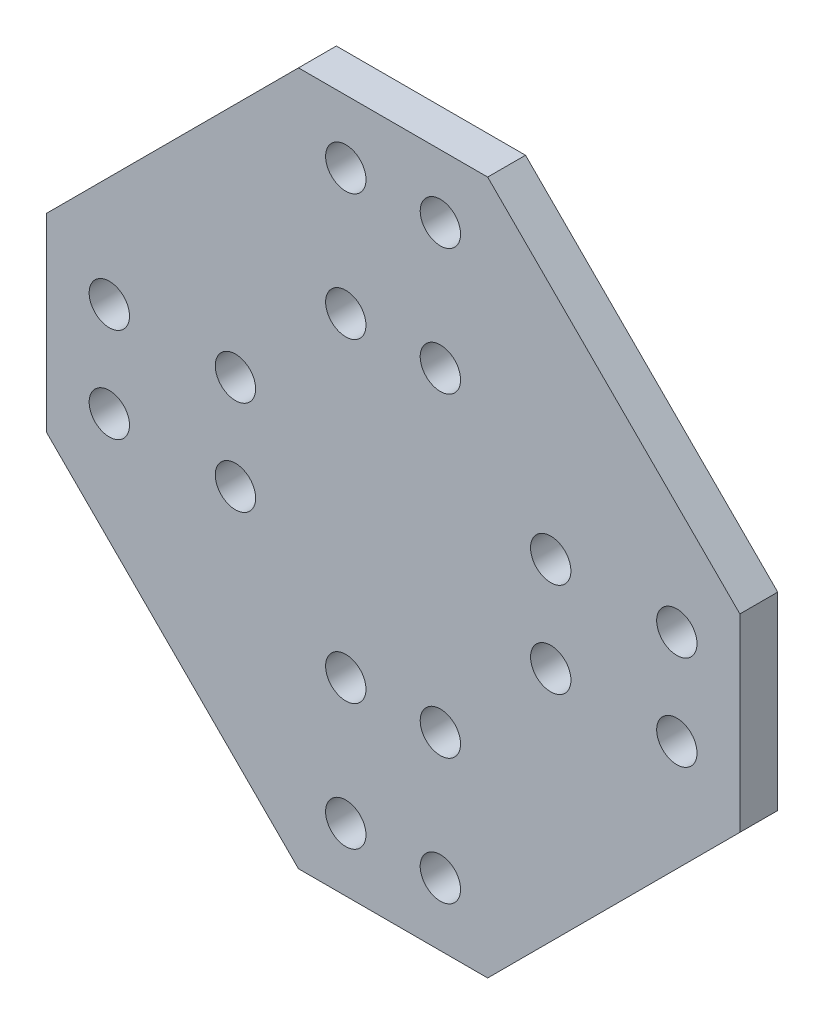
ISO-10303-21;
HEADER;
FILE_DESCRIPTION(('STEP AP214'),'2;1');
FILE_NAME('part.step','',(''),(''),'','','');
FILE_SCHEMA(('AUTOMOTIVE_DESIGN { 1 0 10303 214 1 1 1 1 }'));
ENDSEC;
DATA;
#1=APPLICATION_CONTEXT('core data for automotive mechanical design processes');
#2=APPLICATION_PROTOCOL_DEFINITION('international standard','automotive_design',2000,#1);
#3=PRODUCT_CONTEXT('',#1,'mechanical');
#4=PRODUCT('Part','Part','',(#3));
#5=PRODUCT_RELATED_PRODUCT_CATEGORY('part','',(#4));
#6=PRODUCT_DEFINITION_FORMATION('','',#4);
#7=PRODUCT_DEFINITION_CONTEXT('part definition',#1,'design');
#8=PRODUCT_DEFINITION('design','',#6,#7);
#9=PRODUCT_DEFINITION_SHAPE('','',#8);
#10=(LENGTH_UNIT() NAMED_UNIT(*) SI_UNIT(.MILLI.,.METRE.));
#11=(NAMED_UNIT(*) PLANE_ANGLE_UNIT() SI_UNIT($,.RADIAN.));
#12=(NAMED_UNIT(*) SI_UNIT($,.STERADIAN.) SOLID_ANGLE_UNIT());
#13=UNCERTAINTY_MEASURE_WITH_UNIT(LENGTH_MEASURE(1.E-05),#10,'distance_accuracy_value','');
#14=(GEOMETRIC_REPRESENTATION_CONTEXT(3) GLOBAL_UNCERTAINTY_ASSIGNED_CONTEXT((#13)) GLOBAL_UNIT_ASSIGNED_CONTEXT((#10,
#11,#12)) REPRESENTATION_CONTEXT('',''));
#15=CARTESIAN_POINT('',(0.,0.,0.));
#16=DIRECTION('',(0.,0.,1.));
#17=DIRECTION('',(1.,0.,0.));
#18=AXIS2_PLACEMENT_3D('',#15,#16,#17);
#19=CARTESIAN_POINT('',(-20.,-20.,3.));
#20=DIRECTION('',(0.707106781186548,-0.707106781186547,0.));
#21=DIRECTION('',(0.707106781186547,0.707106781186548,0.));
#22=AXIS2_PLACEMENT_3D('',#19,#20,#21);
#23=PLANE('',#22);
#24=DIRECTION('',(-0.707106781186547,-0.707106781186548,0.));
#25=VECTOR('',#24,1.);
#26=CARTESIAN_POINT('',(-20.,-20.,0.));
#27=LINE('',#26,#25);
#28=CARTESIAN_POINT('',(0.,0.,0.));
#29=VERTEX_POINT('',#28);
#30=CARTESIAN_POINT('',(-20.,-20.,0.));
#31=VERTEX_POINT('',#30);
#32=EDGE_CURVE('E144',#29,#31,#27,.T.);
#33=ORIENTED_EDGE('',*,*,#32,.T.);
#34=DIRECTION('',(0.,0.,-1.));
#35=VECTOR('',#34,1.);
#36=CARTESIAN_POINT('',(-20.,-20.,3.));
#37=LINE('',#36,#35);
#38=CARTESIAN_POINT('',(-20.,-20.,3.));
#39=VERTEX_POINT('',#38);
#40=EDGE_CURVE('E11',#39,#31,#37,.T.);
#41=ORIENTED_EDGE('',*,*,#40,.F.);
#42=DIRECTION('',(-0.707106781186547,-0.707106781186548,0.));
#43=VECTOR('',#42,1.);
#44=CARTESIAN_POINT('',(-20.,-20.,3.));
#45=LINE('',#44,#43);
#46=CARTESIAN_POINT('',(0.,0.,3.));
#47=VERTEX_POINT('',#46);
#48=EDGE_CURVE('E167',#47,#39,#45,.T.);
#49=ORIENTED_EDGE('',*,*,#48,.F.);
#50=DIRECTION('',(0.,0.,-1.));
#51=VECTOR('',#50,1.);
#52=CARTESIAN_POINT('',(0.,0.,3.));
#53=LINE('',#52,#51);
#54=EDGE_CURVE('E140',#47,#29,#53,.T.);
#55=ORIENTED_EDGE('',*,*,#54,.T.);
#56=EDGE_LOOP('',(#33,#41,#49,#55));
#57=FACE_BOUND('',#56,.T.);
#58=ADVANCED_FACE('F43',(#57),#23,.F.);
#59=CARTESIAN_POINT('',(-20.,-35.,3.));
#60=DIRECTION('',(1.,0.,0.));
#61=DIRECTION('',(0.,0.,-1.));
#62=AXIS2_PLACEMENT_3D('',#59,#60,#61);
#63=PLANE('',#62);
#64=DIRECTION('',(0.,-1.,0.));
#65=VECTOR('',#64,1.);
#66=CARTESIAN_POINT('',(-20.,-35.,0.));
#67=LINE('',#66,#65);
#68=CARTESIAN_POINT('',(-20.,-35.,0.));
#69=VERTEX_POINT('',#68);
#70=EDGE_CURVE('E148',#31,#69,#67,.T.);
#71=ORIENTED_EDGE('',*,*,#70,.T.);
#72=DIRECTION('',(0.,0.,-1.));
#73=VECTOR('',#72,1.);
#74=CARTESIAN_POINT('',(-20.,-35.,3.));
#75=LINE('',#74,#73);
#76=CARTESIAN_POINT('',(-20.,-35.,3.));
#77=VERTEX_POINT('',#76);
#78=EDGE_CURVE('E52',#77,#69,#75,.T.);
#79=ORIENTED_EDGE('',*,*,#78,.F.);
#80=DIRECTION('',(0.,-1.,0.));
#81=VECTOR('',#80,1.);
#82=CARTESIAN_POINT('',(-20.,-35.,3.));
#83=LINE('',#82,#81);
#84=EDGE_CURVE('E103',#39,#77,#83,.T.);
#85=ORIENTED_EDGE('',*,*,#84,.F.);
#86=ORIENTED_EDGE('',*,*,#40,.T.);
#87=EDGE_LOOP('',(#71,#79,#85,#86));
#88=FACE_BOUND('',#87,.T.);
#89=ADVANCED_FACE('F370',(#88),#63,.F.);
#90=CARTESIAN_POINT('',(0.,-55.,3.));
#91=DIRECTION('',(0.707106781186547,0.707106781186548,0.));
#92=DIRECTION('',(-0.707106781186548,0.707106781186547,0.));
#93=AXIS2_PLACEMENT_3D('',#90,#91,#92);
#94=PLANE('',#93);
#95=DIRECTION('',(0.707106781186548,-0.707106781186547,0.));
#96=VECTOR('',#95,1.);
#97=CARTESIAN_POINT('',(0.,-55.,0.));
#98=LINE('',#97,#96);
#99=CARTESIAN_POINT('',(0.,-55.,0.));
#100=VERTEX_POINT('',#99);
#101=EDGE_CURVE('E152',#69,#100,#98,.T.);
#102=ORIENTED_EDGE('',*,*,#101,.T.);
#103=DIRECTION('',(0.,0.,-1.));
#104=VECTOR('',#103,1.);
#105=CARTESIAN_POINT('',(0.,-55.,3.));
#106=LINE('',#105,#104);
#107=CARTESIAN_POINT('',(0.,-55.,3.));
#108=VERTEX_POINT('',#107);
#109=EDGE_CURVE('E178',#108,#100,#106,.T.);
#110=ORIENTED_EDGE('',*,*,#109,.F.);
#111=DIRECTION('',(0.707106781186548,-0.707106781186547,0.));
#112=VECTOR('',#111,1.);
#113=CARTESIAN_POINT('',(0.,-55.,3.));
#114=LINE('',#113,#112);
#115=EDGE_CURVE('E188',#77,#108,#114,.T.);
#116=ORIENTED_EDGE('',*,*,#115,.F.);
#117=ORIENTED_EDGE('',*,*,#78,.T.);
#118=EDGE_LOOP('',(#102,#110,#116,#117));
#119=FACE_BOUND('',#118,.T.);
#120=ADVANCED_FACE('F186',(#119),#94,.F.);
#121=CARTESIAN_POINT('',(15.,-55.,3.));
#122=DIRECTION('',(0.,1.,0.));
#123=DIRECTION('',(0.,0.,1.));
#124=AXIS2_PLACEMENT_3D('',#121,#122,#123);
#125=PLANE('',#124);
#126=DIRECTION('',(1.,0.,0.));
#127=VECTOR('',#126,1.);
#128=CARTESIAN_POINT('',(15.,-55.,0.));
#129=LINE('',#128,#127);
#130=CARTESIAN_POINT('',(15.,-55.,0.));
#131=VERTEX_POINT('',#130);
#132=EDGE_CURVE('E155',#100,#131,#129,.T.);
#133=ORIENTED_EDGE('',*,*,#132,.T.);
#134=DIRECTION('',(0.,0.,-1.));
#135=VECTOR('',#134,1.);
#136=CARTESIAN_POINT('',(15.,-55.,3.));
#137=LINE('',#136,#135);
#138=CARTESIAN_POINT('',(15.,-55.,3.));
#139=VERTEX_POINT('',#138);
#140=EDGE_CURVE('E174',#139,#131,#137,.T.);
#141=ORIENTED_EDGE('',*,*,#140,.F.);
#142=DIRECTION('',(1.,0.,0.));
#143=VECTOR('',#142,1.);
#144=CARTESIAN_POINT('',(15.,-55.,3.));
#145=LINE('',#144,#143);
#146=EDGE_CURVE('E201',#108,#139,#145,.T.);
#147=ORIENTED_EDGE('',*,*,#146,.F.);
#148=ORIENTED_EDGE('',*,*,#109,.T.);
#149=EDGE_LOOP('',(#133,#141,#147,#148));
#150=FACE_BOUND('',#149,.T.);
#151=ADVANCED_FACE('F196',(#150),#125,.F.);
#152=CARTESIAN_POINT('',(35.,-35.,3.));
#153=DIRECTION('',(-0.707106781186547,0.707106781186547,0.));
#154=DIRECTION('',(-0.707106781186548,-0.707106781186548,0.));
#155=AXIS2_PLACEMENT_3D('',#152,#153,#154);
#156=PLANE('',#155);
#157=DIRECTION('',(0.707106781186548,0.707106781186548,0.));
#158=VECTOR('',#157,1.);
#159=CARTESIAN_POINT('',(35.,-35.,0.));
#160=LINE('',#159,#158);
#161=CARTESIAN_POINT('',(35.,-35.,0.));
#162=VERTEX_POINT('',#161);
#163=EDGE_CURVE('E158',#131,#162,#160,.T.);
#164=ORIENTED_EDGE('',*,*,#163,.T.);
#165=DIRECTION('',(0.,0.,-1.));
#166=VECTOR('',#165,1.);
#167=CARTESIAN_POINT('',(35.,-35.,3.));
#168=LINE('',#167,#166);
#169=CARTESIAN_POINT('',(35.,-35.,3.));
#170=VERTEX_POINT('',#169);
#171=EDGE_CURVE('E133',#170,#162,#168,.T.);
#172=ORIENTED_EDGE('',*,*,#171,.F.);
#173=DIRECTION('',(0.707106781186548,0.707106781186548,0.));
#174=VECTOR('',#173,1.);
#175=CARTESIAN_POINT('',(35.,-35.,3.));
#176=LINE('',#175,#174);
#177=EDGE_CURVE('E122',#139,#170,#176,.T.);
#178=ORIENTED_EDGE('',*,*,#177,.F.);
#179=ORIENTED_EDGE('',*,*,#140,.T.);
#180=EDGE_LOOP('',(#164,#172,#178,#179));
#181=FACE_BOUND('',#180,.T.);
#182=ADVANCED_FACE('F199',(#181),#156,.F.);
#183=CARTESIAN_POINT('',(35.,-20.,3.));
#184=DIRECTION('',(-1.,0.,0.));
#185=DIRECTION('',(0.,0.,1.));
#186=AXIS2_PLACEMENT_3D('',#183,#184,#185);
#187=PLANE('',#186);
#188=DIRECTION('',(0.,1.,0.));
#189=VECTOR('',#188,1.);
#190=CARTESIAN_POINT('',(35.,-20.,0.));
#191=LINE('',#190,#189);
#192=CARTESIAN_POINT('',(35.,-20.,0.));
#193=VERTEX_POINT('',#192);
#194=EDGE_CURVE('E131',#162,#193,#191,.T.);
#195=ORIENTED_EDGE('',*,*,#194,.T.);
#196=DIRECTION('',(0.,0.,-1.));
#197=VECTOR('',#196,1.);
#198=CARTESIAN_POINT('',(35.,-20.,3.));
#199=LINE('',#198,#197);
#200=CARTESIAN_POINT('',(35.,-20.,3.));
#201=VERTEX_POINT('',#200);
#202=EDGE_CURVE('E128',#201,#193,#199,.T.);
#203=ORIENTED_EDGE('',*,*,#202,.F.);
#204=DIRECTION('',(0.,1.,0.));
#205=VECTOR('',#204,1.);
#206=CARTESIAN_POINT('',(35.,-20.,3.));
#207=LINE('',#206,#205);
#208=EDGE_CURVE('E116',#170,#201,#207,.T.);
#209=ORIENTED_EDGE('',*,*,#208,.F.);
#210=ORIENTED_EDGE('',*,*,#171,.T.);
#211=EDGE_LOOP('',(#195,#203,#209,#210));
#212=FACE_BOUND('',#211,.T.);
#213=ADVANCED_FACE('F129',(#212),#187,.F.);
#214=CARTESIAN_POINT('',(15.,0.,3.));
#215=DIRECTION('',(-0.707106781186547,-0.707106781186548,0.));
#216=DIRECTION('',(0.707106781186548,-0.707106781186547,0.));
#217=AXIS2_PLACEMENT_3D('',#214,#215,#216);
#218=PLANE('',#217);
#219=DIRECTION('',(-0.707106781186548,0.707106781186547,0.));
#220=VECTOR('',#219,1.);
#221=CARTESIAN_POINT('',(15.,0.,0.));
#222=LINE('',#221,#220);
#223=CARTESIAN_POINT('',(15.,0.,0.));
#224=VERTEX_POINT('',#223);
#225=EDGE_CURVE('E89',#193,#224,#222,.T.);
#226=ORIENTED_EDGE('',*,*,#225,.T.);
#227=DIRECTION('',(0.,0.,-1.));
#228=VECTOR('',#227,1.);
#229=CARTESIAN_POINT('',(15.,0.,3.));
#230=LINE('',#229,#228);
#231=CARTESIAN_POINT('',(15.,0.,3.));
#232=VERTEX_POINT('',#231);
#233=EDGE_CURVE('E134',#232,#224,#230,.T.);
#234=ORIENTED_EDGE('',*,*,#233,.F.);
#235=DIRECTION('',(-0.707106781186548,0.707106781186547,0.));
#236=VECTOR('',#235,1.);
#237=CARTESIAN_POINT('',(15.,0.,3.));
#238=LINE('',#237,#236);
#239=EDGE_CURVE('E120',#201,#232,#238,.T.);
#240=ORIENTED_EDGE('',*,*,#239,.F.);
#241=ORIENTED_EDGE('',*,*,#202,.T.);
#242=EDGE_LOOP('',(#226,#234,#240,#241));
#243=FACE_BOUND('',#242,.T.);
#244=ADVANCED_FACE('F136',(#243),#218,.F.);
#245=CARTESIAN_POINT('',(0.,0.,3.));
#246=DIRECTION('',(0.,-1.,0.));
#247=DIRECTION('',(0.,0.,-1.));
#248=AXIS2_PLACEMENT_3D('',#245,#246,#247);
#249=PLANE('',#248);
#250=DIRECTION('',(-1.,0.,0.));
#251=VECTOR('',#250,1.);
#252=CARTESIAN_POINT('',(0.,0.,0.));
#253=LINE('',#252,#251);
#254=EDGE_CURVE('E95',#224,#29,#253,.T.);
#255=ORIENTED_EDGE('',*,*,#254,.T.);
#256=ORIENTED_EDGE('',*,*,#54,.F.);
#257=DIRECTION('',(-1.,0.,0.));
#258=VECTOR('',#257,1.);
#259=CARTESIAN_POINT('',(0.,0.,3.));
#260=LINE('',#259,#258);
#261=EDGE_CURVE('E60',#232,#47,#260,.T.);
#262=ORIENTED_EDGE('',*,*,#261,.F.);
#263=ORIENTED_EDGE('',*,*,#233,.T.);
#264=EDGE_LOOP('',(#255,#256,#262,#263));
#265=FACE_BOUND('',#264,.T.);
#266=ADVANCED_FACE('F377',(#265),#249,.F.);
#267=CARTESIAN_POINT('',(0.,0.,3.));
#268=DIRECTION('',(0.,0.,-1.));
#269=DIRECTION('',(-1.,0.,0.));
#270=AXIS2_PLACEMENT_3D('',#267,#268,#269);
#271=PLANE('',#270);
#272=CARTESIAN_POINT('',(-5.,-31.25,3.));
#273=DIRECTION('',(0.,0.,-1.));
#274=DIRECTION('',(-1.,0.,0.));
#275=AXIS2_PLACEMENT_3D('',#272,#273,#274);
#276=CIRCLE('',#275,1.6);
#277=CARTESIAN_POINT('',(-6.6,-31.25,3.));
#278=VERTEX_POINT('',#277);
#279=EDGE_CURVE('E251',#278,#278,#276,.T.);
#280=ORIENTED_EDGE('',*,*,#279,.T.);
#281=EDGE_LOOP('',(#280));
#282=FACE_BOUND('',#281,.T.);
#283=CARTESIAN_POINT('',(20.,-31.25,3.));
#284=DIRECTION('',(0.,0.,-1.));
#285=DIRECTION('',(1.,0.,0.));
#286=AXIS2_PLACEMENT_3D('',#283,#284,#285);
#287=CIRCLE('',#286,1.6);
#288=CARTESIAN_POINT('',(21.6,-31.25,3.));
#289=VERTEX_POINT('',#288);
#290=EDGE_CURVE('E260',#289,#289,#287,.T.);
#291=ORIENTED_EDGE('',*,*,#290,.T.);
#292=EDGE_LOOP('',(#291));
#293=FACE_BOUND('',#292,.T.);
#294=CARTESIAN_POINT('',(20.,-23.75,3.));
#295=DIRECTION('',(0.,0.,-1.));
#296=DIRECTION('',(-1.,0.,0.));
#297=AXIS2_PLACEMENT_3D('',#294,#295,#296);
#298=CIRCLE('',#297,1.6);
#299=CARTESIAN_POINT('',(18.4,-23.75,3.));
#300=VERTEX_POINT('',#299);
#301=EDGE_CURVE('E268',#300,#300,#298,.T.);
#302=ORIENTED_EDGE('',*,*,#301,.T.);
#303=EDGE_LOOP('',(#302));
#304=FACE_BOUND('',#303,.T.);
#305=CARTESIAN_POINT('',(11.25,-15.,3.));
#306=DIRECTION('',(0.,0.,-1.));
#307=DIRECTION('',(1.,0.,0.));
#308=AXIS2_PLACEMENT_3D('',#305,#306,#307);
#309=CIRCLE('',#308,1.6);
#310=CARTESIAN_POINT('',(12.85,-15.,3.));
#311=VERTEX_POINT('',#310);
#312=EDGE_CURVE('E276',#311,#311,#309,.T.);
#313=ORIENTED_EDGE('',*,*,#312,.T.);
#314=EDGE_LOOP('',(#313));
#315=FACE_BOUND('',#314,.T.);
#316=CARTESIAN_POINT('',(3.74999999999999,-15.,3.));
#317=DIRECTION('',(0.,0.,-1.));
#318=DIRECTION('',(-1.,0.,0.));
#319=AXIS2_PLACEMENT_3D('',#316,#317,#318);
#320=CIRCLE('',#319,1.6);
#321=CARTESIAN_POINT('',(2.14999999999999,-15.,3.));
#322=VERTEX_POINT('',#321);
#323=EDGE_CURVE('E219',#322,#322,#320,.T.);
#324=ORIENTED_EDGE('',*,*,#323,.T.);
#325=EDGE_LOOP('',(#324));
#326=FACE_BOUND('',#325,.T.);
#327=CARTESIAN_POINT('',(3.74999999999999,-5.,3.));
#328=DIRECTION('',(0.,0.,-1.));
#329=DIRECTION('',(1.,0.,0.));
#330=AXIS2_PLACEMENT_3D('',#327,#328,#329);
#331=CIRCLE('',#330,1.6);
#332=CARTESIAN_POINT('',(5.34999999999999,-5.,3.));
#333=VERTEX_POINT('',#332);
#334=EDGE_CURVE('E228',#333,#333,#331,.T.);
#335=ORIENTED_EDGE('',*,*,#334,.T.);
#336=EDGE_LOOP('',(#335));
#337=FACE_BOUND('',#336,.T.);
#338=CARTESIAN_POINT('',(30.,-23.75,3.));
#339=DIRECTION('',(0.,0.,-1.));
#340=DIRECTION('',(1.,0.,0.));
#341=AXIS2_PLACEMENT_3D('',#338,#339,#340);
#342=CIRCLE('',#341,1.6);
#343=CARTESIAN_POINT('',(31.6,-23.75,3.));
#344=VERTEX_POINT('',#343);
#345=EDGE_CURVE('E236',#344,#344,#342,.T.);
#346=ORIENTED_EDGE('',*,*,#345,.T.);
#347=EDGE_LOOP('',(#346));
#348=FACE_BOUND('',#347,.T.);
#349=CARTESIAN_POINT('',(30.,-31.25,3.));
#350=DIRECTION('',(0.,0.,-1.));
#351=DIRECTION('',(-1.,0.,0.));
#352=AXIS2_PLACEMENT_3D('',#349,#350,#351);
#353=CIRCLE('',#352,1.6);
#354=CARTESIAN_POINT('',(28.4,-31.25,3.));
#355=VERTEX_POINT('',#354);
#356=EDGE_CURVE('E244',#355,#355,#353,.T.);
#357=ORIENTED_EDGE('',*,*,#356,.T.);
#358=EDGE_LOOP('',(#357));
#359=FACE_BOUND('',#358,.T.);
#360=CARTESIAN_POINT('',(11.25,-50.,3.));
#361=DIRECTION('',(0.,0.,-1.));
#362=DIRECTION('',(1.,0.,0.));
#363=AXIS2_PLACEMENT_3D('',#360,#361,#362);
#364=CIRCLE('',#363,1.6);
#365=CARTESIAN_POINT('',(12.85,-50.,3.));
#366=VERTEX_POINT('',#365);
#367=EDGE_CURVE('E315',#366,#366,#364,.T.);
#368=ORIENTED_EDGE('',*,*,#367,.T.);
#369=EDGE_LOOP('',(#368));
#370=FACE_BOUND('',#369,.T.);
#371=CARTESIAN_POINT('',(3.74999999999999,-50.,3.));
#372=DIRECTION('',(0.,0.,-1.));
#373=DIRECTION('',(-1.,0.,0.));
#374=AXIS2_PLACEMENT_3D('',#371,#372,#373);
#375=CIRCLE('',#374,1.60000000000001);
#376=CARTESIAN_POINT('',(2.14999999999998,-50.,3.));
#377=VERTEX_POINT('',#376);
#378=EDGE_CURVE('E323',#377,#377,#375,.T.);
#379=ORIENTED_EDGE('',*,*,#378,.T.);
#380=EDGE_LOOP('',(#379));
#381=FACE_BOUND('',#380,.T.);
#382=CARTESIAN_POINT('',(3.74999999999999,-40.,3.));
#383=DIRECTION('',(0.,0.,-1.));
#384=DIRECTION('',(1.,0.,0.));
#385=AXIS2_PLACEMENT_3D('',#382,#383,#384);
#386=CIRCLE('',#385,1.6);
#387=CARTESIAN_POINT('',(5.34999999999999,-40.,3.));
#388=VERTEX_POINT('',#387);
#389=EDGE_CURVE('E331',#388,#388,#386,.T.);
#390=ORIENTED_EDGE('',*,*,#389,.T.);
#391=EDGE_LOOP('',(#390));
#392=FACE_BOUND('',#391,.T.);
#393=CARTESIAN_POINT('',(11.25,-40.,3.));
#394=DIRECTION('',(0.,0.,-1.));
#395=DIRECTION('',(-1.,0.,0.));
#396=AXIS2_PLACEMENT_3D('',#393,#394,#395);
#397=CIRCLE('',#396,1.6);
#398=CARTESIAN_POINT('',(9.65000000000001,-40.,3.));
#399=VERTEX_POINT('',#398);
#400=EDGE_CURVE('E283',#399,#399,#397,.T.);
#401=ORIENTED_EDGE('',*,*,#400,.T.);
#402=EDGE_LOOP('',(#401));
#403=FACE_BOUND('',#402,.T.);
#404=CARTESIAN_POINT('',(-15.,-31.25,3.));
#405=DIRECTION('',(0.,0.,-1.));
#406=DIRECTION('',(1.,0.,0.));
#407=AXIS2_PLACEMENT_3D('',#404,#405,#406);
#408=CIRCLE('',#407,1.6);
#409=CARTESIAN_POINT('',(-13.4,-31.25,3.));
#410=VERTEX_POINT('',#409);
#411=EDGE_CURVE('E292',#410,#410,#408,.T.);
#412=ORIENTED_EDGE('',*,*,#411,.T.);
#413=EDGE_LOOP('',(#412));
#414=FACE_BOUND('',#413,.T.);
#415=CARTESIAN_POINT('',(-15.,-23.75,3.));
#416=DIRECTION('',(0.,0.,-1.));
#417=DIRECTION('',(-1.,0.,0.));
#418=AXIS2_PLACEMENT_3D('',#415,#416,#417);
#419=CIRCLE('',#418,1.6);
#420=CARTESIAN_POINT('',(-16.6,-23.75,3.));
#421=VERTEX_POINT('',#420);
#422=EDGE_CURVE('E300',#421,#421,#419,.T.);
#423=ORIENTED_EDGE('',*,*,#422,.T.);
#424=EDGE_LOOP('',(#423));
#425=FACE_BOUND('',#424,.T.);
#426=CARTESIAN_POINT('',(-5.,-23.75,3.));
#427=DIRECTION('',(0.,0.,-1.));
#428=DIRECTION('',(1.,0.,0.));
#429=AXIS2_PLACEMENT_3D('',#426,#427,#428);
#430=CIRCLE('',#429,1.6);
#431=CARTESIAN_POINT('',(-3.4,-23.75,3.));
#432=VERTEX_POINT('',#431);
#433=EDGE_CURVE('E308',#432,#432,#430,.T.);
#434=ORIENTED_EDGE('',*,*,#433,.T.);
#435=EDGE_LOOP('',(#434));
#436=FACE_BOUND('',#435,.T.);
#437=CARTESIAN_POINT('',(11.25,-5.,3.));
#438=DIRECTION('',(0.,0.,-1.));
#439=DIRECTION('',(-1.,0.,0.));
#440=AXIS2_PLACEMENT_3D('',#437,#438,#439);
#441=CIRCLE('',#440,1.6);
#442=CARTESIAN_POINT('',(9.65000000000001,-5.,3.));
#443=VERTEX_POINT('',#442);
#444=EDGE_CURVE('E149',#443,#443,#441,.T.);
#445=ORIENTED_EDGE('',*,*,#444,.T.);
#446=EDGE_LOOP('',(#445));
#447=FACE_BOUND('',#446,.T.);
#448=ORIENTED_EDGE('',*,*,#48,.T.);
#449=ORIENTED_EDGE('',*,*,#84,.T.);
#450=ORIENTED_EDGE('',*,*,#115,.T.);
#451=ORIENTED_EDGE('',*,*,#146,.T.);
#452=ORIENTED_EDGE('',*,*,#177,.T.);
#453=ORIENTED_EDGE('',*,*,#208,.T.);
#454=ORIENTED_EDGE('',*,*,#239,.T.);
#455=ORIENTED_EDGE('',*,*,#261,.T.);
#456=EDGE_LOOP('',(#448,#449,#450,#451,#452,#453,#454,#455));
#457=FACE_BOUND('',#456,.T.);
#458=ADVANCED_FACE('F118',(#282,#293,#304,#315,#326,#337,#348,#359,#370,#381,#392,#403,#414,
#425,#436,#447,#457),#271,.F.);
#459=CARTESIAN_POINT('',(0.,0.,0.));
#460=DIRECTION('',(0.,0.,-1.));
#461=DIRECTION('',(-1.,0.,0.));
#462=AXIS2_PLACEMENT_3D('',#459,#460,#461);
#463=PLANE('',#462);
#464=CARTESIAN_POINT('',(-5.,-31.25,0.));
#465=DIRECTION('',(0.,0.,-1.));
#466=DIRECTION('',(-1.,0.,0.));
#467=AXIS2_PLACEMENT_3D('',#464,#465,#466);
#468=CIRCLE('',#467,1.6);
#469=CARTESIAN_POINT('',(-6.6,-31.25,0.));
#470=VERTEX_POINT('',#469);
#471=EDGE_CURVE('E255',#470,#470,#468,.T.);
#472=ORIENTED_EDGE('',*,*,#471,.F.);
#473=EDGE_LOOP('',(#472));
#474=FACE_BOUND('',#473,.T.);
#475=CARTESIAN_POINT('',(20.,-31.25,0.));
#476=DIRECTION('',(0.,0.,-1.));
#477=DIRECTION('',(1.,0.,0.));
#478=AXIS2_PLACEMENT_3D('',#475,#476,#477);
#479=CIRCLE('',#478,1.6);
#480=CARTESIAN_POINT('',(21.6,-31.25,0.));
#481=VERTEX_POINT('',#480);
#482=EDGE_CURVE('E264',#481,#481,#479,.T.);
#483=ORIENTED_EDGE('',*,*,#482,.F.);
#484=EDGE_LOOP('',(#483));
#485=FACE_BOUND('',#484,.T.);
#486=CARTESIAN_POINT('',(20.,-23.75,0.));
#487=DIRECTION('',(0.,0.,-1.));
#488=DIRECTION('',(-1.,0.,0.));
#489=AXIS2_PLACEMENT_3D('',#486,#487,#488);
#490=CIRCLE('',#489,1.6);
#491=CARTESIAN_POINT('',(18.4,-23.75,0.));
#492=VERTEX_POINT('',#491);
#493=EDGE_CURVE('E272',#492,#492,#490,.T.);
#494=ORIENTED_EDGE('',*,*,#493,.F.);
#495=EDGE_LOOP('',(#494));
#496=FACE_BOUND('',#495,.T.);
#497=CARTESIAN_POINT('',(11.25,-15.,0.));
#498=DIRECTION('',(0.,0.,-1.));
#499=DIRECTION('',(1.,0.,0.));
#500=AXIS2_PLACEMENT_3D('',#497,#498,#499);
#501=CIRCLE('',#500,1.6);
#502=CARTESIAN_POINT('',(12.85,-15.,0.));
#503=VERTEX_POINT('',#502);
#504=EDGE_CURVE('E224',#503,#503,#501,.T.);
#505=ORIENTED_EDGE('',*,*,#504,.F.);
#506=EDGE_LOOP('',(#505));
#507=FACE_BOUND('',#506,.T.);
#508=CARTESIAN_POINT('',(3.74999999999999,-15.,0.));
#509=DIRECTION('',(0.,0.,-1.));
#510=DIRECTION('',(-1.,0.,0.));
#511=AXIS2_PLACEMENT_3D('',#508,#509,#510);
#512=CIRCLE('',#511,1.6);
#513=CARTESIAN_POINT('',(2.14999999999999,-15.,0.));
#514=VERTEX_POINT('',#513);
#515=EDGE_CURVE('E223',#514,#514,#512,.T.);
#516=ORIENTED_EDGE('',*,*,#515,.F.);
#517=EDGE_LOOP('',(#516));
#518=FACE_BOUND('',#517,.T.);
#519=CARTESIAN_POINT('',(3.74999999999999,-5.,0.));
#520=DIRECTION('',(0.,0.,-1.));
#521=DIRECTION('',(1.,0.,0.));
#522=AXIS2_PLACEMENT_3D('',#519,#520,#521);
#523=CIRCLE('',#522,1.6);
#524=CARTESIAN_POINT('',(5.34999999999999,-5.,0.));
#525=VERTEX_POINT('',#524);
#526=EDGE_CURVE('E232',#525,#525,#523,.T.);
#527=ORIENTED_EDGE('',*,*,#526,.F.);
#528=EDGE_LOOP('',(#527));
#529=FACE_BOUND('',#528,.T.);
#530=CARTESIAN_POINT('',(30.,-23.75,0.));
#531=DIRECTION('',(0.,0.,-1.));
#532=DIRECTION('',(1.,0.,0.));
#533=AXIS2_PLACEMENT_3D('',#530,#531,#532);
#534=CIRCLE('',#533,1.6);
#535=CARTESIAN_POINT('',(31.6,-23.75,0.));
#536=VERTEX_POINT('',#535);
#537=EDGE_CURVE('E240',#536,#536,#534,.T.);
#538=ORIENTED_EDGE('',*,*,#537,.F.);
#539=EDGE_LOOP('',(#538));
#540=FACE_BOUND('',#539,.T.);
#541=CARTESIAN_POINT('',(30.,-31.25,0.));
#542=DIRECTION('',(0.,0.,-1.));
#543=DIRECTION('',(-1.,0.,0.));
#544=AXIS2_PLACEMENT_3D('',#541,#542,#543);
#545=CIRCLE('',#544,1.6);
#546=CARTESIAN_POINT('',(28.4,-31.25,0.));
#547=VERTEX_POINT('',#546);
#548=EDGE_CURVE('E215',#547,#547,#545,.T.);
#549=ORIENTED_EDGE('',*,*,#548,.F.);
#550=EDGE_LOOP('',(#549));
#551=FACE_BOUND('',#550,.T.);
#552=CARTESIAN_POINT('',(11.25,-50.,0.));
#553=DIRECTION('',(0.,0.,-1.));
#554=DIRECTION('',(1.,0.,0.));
#555=AXIS2_PLACEMENT_3D('',#552,#553,#554);
#556=CIRCLE('',#555,1.6);
#557=CARTESIAN_POINT('',(12.85,-50.,0.));
#558=VERTEX_POINT('',#557);
#559=EDGE_CURVE('E319',#558,#558,#556,.T.);
#560=ORIENTED_EDGE('',*,*,#559,.F.);
#561=EDGE_LOOP('',(#560));
#562=FACE_BOUND('',#561,.T.);
#563=CARTESIAN_POINT('',(3.74999999999999,-50.,0.));
#564=DIRECTION('',(0.,0.,-1.));
#565=DIRECTION('',(-1.,0.,0.));
#566=AXIS2_PLACEMENT_3D('',#563,#564,#565);
#567=CIRCLE('',#566,1.60000000000001);
#568=CARTESIAN_POINT('',(2.14999999999998,-50.,0.));
#569=VERTEX_POINT('',#568);
#570=EDGE_CURVE('E327',#569,#569,#567,.T.);
#571=ORIENTED_EDGE('',*,*,#570,.F.);
#572=EDGE_LOOP('',(#571));
#573=FACE_BOUND('',#572,.T.);
#574=CARTESIAN_POINT('',(3.74999999999999,-40.,0.));
#575=DIRECTION('',(0.,0.,-1.));
#576=DIRECTION('',(1.,0.,0.));
#577=AXIS2_PLACEMENT_3D('',#574,#575,#576);
#578=CIRCLE('',#577,1.6);
#579=CARTESIAN_POINT('',(5.34999999999999,-40.,0.));
#580=VERTEX_POINT('',#579);
#581=EDGE_CURVE('E288',#580,#580,#578,.T.);
#582=ORIENTED_EDGE('',*,*,#581,.F.);
#583=EDGE_LOOP('',(#582));
#584=FACE_BOUND('',#583,.T.);
#585=CARTESIAN_POINT('',(11.25,-40.,0.));
#586=DIRECTION('',(0.,0.,-1.));
#587=DIRECTION('',(-1.,0.,0.));
#588=AXIS2_PLACEMENT_3D('',#585,#586,#587);
#589=CIRCLE('',#588,1.6);
#590=CARTESIAN_POINT('',(9.65000000000001,-40.,0.));
#591=VERTEX_POINT('',#590);
#592=EDGE_CURVE('E287',#591,#591,#589,.T.);
#593=ORIENTED_EDGE('',*,*,#592,.F.);
#594=EDGE_LOOP('',(#593));
#595=FACE_BOUND('',#594,.T.);
#596=CARTESIAN_POINT('',(-15.,-31.25,0.));
#597=DIRECTION('',(0.,0.,-1.));
#598=DIRECTION('',(1.,0.,0.));
#599=AXIS2_PLACEMENT_3D('',#596,#597,#598);
#600=CIRCLE('',#599,1.6);
#601=CARTESIAN_POINT('',(-13.4,-31.25,0.));
#602=VERTEX_POINT('',#601);
#603=EDGE_CURVE('E296',#602,#602,#600,.T.);
#604=ORIENTED_EDGE('',*,*,#603,.F.);
#605=EDGE_LOOP('',(#604));
#606=FACE_BOUND('',#605,.T.);
#607=CARTESIAN_POINT('',(-15.,-23.75,0.));
#608=DIRECTION('',(0.,0.,-1.));
#609=DIRECTION('',(-1.,0.,0.));
#610=AXIS2_PLACEMENT_3D('',#607,#608,#609);
#611=CIRCLE('',#610,1.6);
#612=CARTESIAN_POINT('',(-16.6,-23.75,0.));
#613=VERTEX_POINT('',#612);
#614=EDGE_CURVE('E304',#613,#613,#611,.T.);
#615=ORIENTED_EDGE('',*,*,#614,.F.);
#616=EDGE_LOOP('',(#615));
#617=FACE_BOUND('',#616,.T.);
#618=CARTESIAN_POINT('',(-5.,-23.75,0.));
#619=DIRECTION('',(0.,0.,-1.));
#620=DIRECTION('',(1.,0.,0.));
#621=AXIS2_PLACEMENT_3D('',#618,#619,#620);
#622=CIRCLE('',#621,1.6);
#623=CARTESIAN_POINT('',(-3.4,-23.75,0.));
#624=VERTEX_POINT('',#623);
#625=EDGE_CURVE('E256',#624,#624,#622,.T.);
#626=ORIENTED_EDGE('',*,*,#625,.F.);
#627=EDGE_LOOP('',(#626));
#628=FACE_BOUND('',#627,.T.);
#629=CARTESIAN_POINT('',(11.25,-5.,0.));
#630=DIRECTION('',(0.,0.,-1.));
#631=DIRECTION('',(-1.,0.,0.));
#632=AXIS2_PLACEMENT_3D('',#629,#630,#631);
#633=CIRCLE('',#632,1.6);
#634=CARTESIAN_POINT('',(9.65000000000001,-5.,0.));
#635=VERTEX_POINT('',#634);
#636=EDGE_CURVE('E211',#635,#635,#633,.T.);
#637=ORIENTED_EDGE('',*,*,#636,.F.);
#638=EDGE_LOOP('',(#637));
#639=FACE_BOUND('',#638,.T.);
#640=ORIENTED_EDGE('',*,*,#32,.F.);
#641=ORIENTED_EDGE('',*,*,#254,.F.);
#642=ORIENTED_EDGE('',*,*,#225,.F.);
#643=ORIENTED_EDGE('',*,*,#194,.F.);
#644=ORIENTED_EDGE('',*,*,#163,.F.);
#645=ORIENTED_EDGE('',*,*,#132,.F.);
#646=ORIENTED_EDGE('',*,*,#101,.F.);
#647=ORIENTED_EDGE('',*,*,#70,.F.);
#648=EDGE_LOOP('',(#640,#641,#642,#643,#644,#645,#646,#647));
#649=FACE_BOUND('',#648,.T.);
#650=ADVANCED_FACE('F192',(#474,#485,#496,#507,#518,#529,#540,#551,#562,#573,#584,#595,#606,
#617,#628,#639,#649),#463,.T.);
#651=CARTESIAN_POINT('',(11.25,-5.,3.));
#652=DIRECTION('',(0.,0.,-1.));
#653=DIRECTION('',(-1.,0.,0.));
#654=AXIS2_PLACEMENT_3D('',#651,#652,#653);
#655=CYLINDRICAL_SURFACE('',#654,1.6);
#656=ORIENTED_EDGE('',*,*,#444,.F.);
#657=EDGE_LOOP('',(#656));
#658=FACE_BOUND('',#657,.T.);
#659=ORIENTED_EDGE('',*,*,#636,.T.);
#660=EDGE_LOOP('',(#659));
#661=FACE_BOUND('',#660,.T.);
#662=ADVANCED_FACE('F343',(#658,#661),#655,.F.);
#663=CARTESIAN_POINT('',(-5.,-23.75,3.));
#664=DIRECTION('',(0.,0.,-1.));
#665=DIRECTION('',(-1.,0.,0.));
#666=AXIS2_PLACEMENT_3D('',#663,#664,#665);
#667=CYLINDRICAL_SURFACE('',#666,1.6);
#668=ORIENTED_EDGE('',*,*,#433,.F.);
#669=EDGE_LOOP('',(#668));
#670=FACE_BOUND('',#669,.T.);
#671=ORIENTED_EDGE('',*,*,#625,.T.);
#672=EDGE_LOOP('',(#671));
#673=FACE_BOUND('',#672,.T.);
#674=ADVANCED_FACE('F357',(#670,#673),#667,.F.);
#675=CARTESIAN_POINT('',(-15.,-23.75,3.));
#676=DIRECTION('',(0.,0.,-1.));
#677=DIRECTION('',(-1.,0.,0.));
#678=AXIS2_PLACEMENT_3D('',#675,#676,#677);
#679=CYLINDRICAL_SURFACE('',#678,1.6);
#680=ORIENTED_EDGE('',*,*,#422,.F.);
#681=EDGE_LOOP('',(#680));
#682=FACE_BOUND('',#681,.T.);
#683=ORIENTED_EDGE('',*,*,#614,.T.);
#684=EDGE_LOOP('',(#683));
#685=FACE_BOUND('',#684,.T.);
#686=ADVANCED_FACE('F363',(#682,#685),#679,.F.);
#687=CARTESIAN_POINT('',(-15.,-31.25,3.));
#688=DIRECTION('',(0.,0.,-1.));
#689=DIRECTION('',(-1.,0.,0.));
#690=AXIS2_PLACEMENT_3D('',#687,#688,#689);
#691=CYLINDRICAL_SURFACE('',#690,1.6);
#692=ORIENTED_EDGE('',*,*,#411,.F.);
#693=EDGE_LOOP('',(#692));
#694=FACE_BOUND('',#693,.T.);
#695=ORIENTED_EDGE('',*,*,#603,.T.);
#696=EDGE_LOOP('',(#695));
#697=FACE_BOUND('',#696,.T.);
#698=ADVANCED_FACE('F455',(#694,#697),#691,.F.);
#699=CARTESIAN_POINT('',(11.25,-40.,3.));
#700=DIRECTION('',(0.,0.,-1.));
#701=DIRECTION('',(-1.,0.,0.));
#702=AXIS2_PLACEMENT_3D('',#699,#700,#701);
#703=CYLINDRICAL_SURFACE('',#702,1.6);
#704=ORIENTED_EDGE('',*,*,#400,.F.);
#705=EDGE_LOOP('',(#704));
#706=FACE_BOUND('',#705,.T.);
#707=ORIENTED_EDGE('',*,*,#592,.T.);
#708=EDGE_LOOP('',(#707));
#709=FACE_BOUND('',#708,.T.);
#710=ADVANCED_FACE('F466',(#706,#709),#703,.F.);
#711=CARTESIAN_POINT('',(3.74999999999999,-40.,3.));
#712=DIRECTION('',(0.,0.,-1.));
#713=DIRECTION('',(-1.,0.,0.));
#714=AXIS2_PLACEMENT_3D('',#711,#712,#713);
#715=CYLINDRICAL_SURFACE('',#714,1.6);
#716=ORIENTED_EDGE('',*,*,#389,.F.);
#717=EDGE_LOOP('',(#716));
#718=FACE_BOUND('',#717,.T.);
#719=ORIENTED_EDGE('',*,*,#581,.T.);
#720=EDGE_LOOP('',(#719));
#721=FACE_BOUND('',#720,.T.);
#722=ADVANCED_FACE('F339',(#718,#721),#715,.F.);
#723=CARTESIAN_POINT('',(3.74999999999999,-50.,3.));
#724=DIRECTION('',(0.,0.,-1.));
#725=DIRECTION('',(-1.,0.,0.));
#726=AXIS2_PLACEMENT_3D('',#723,#724,#725);
#727=CYLINDRICAL_SURFACE('',#726,1.60000000000001);
#728=ORIENTED_EDGE('',*,*,#378,.F.);
#729=EDGE_LOOP('',(#728));
#730=FACE_BOUND('',#729,.T.);
#731=ORIENTED_EDGE('',*,*,#570,.T.);
#732=EDGE_LOOP('',(#731));
#733=FACE_BOUND('',#732,.T.);
#734=ADVANCED_FACE('F487',(#730,#733),#727,.F.);
#735=CARTESIAN_POINT('',(11.25,-50.,3.));
#736=DIRECTION('',(0.,0.,-1.));
#737=DIRECTION('',(-1.,0.,0.));
#738=AXIS2_PLACEMENT_3D('',#735,#736,#737);
#739=CYLINDRICAL_SURFACE('',#738,1.6);
#740=ORIENTED_EDGE('',*,*,#367,.F.);
#741=EDGE_LOOP('',(#740));
#742=FACE_BOUND('',#741,.T.);
#743=ORIENTED_EDGE('',*,*,#559,.T.);
#744=EDGE_LOOP('',(#743));
#745=FACE_BOUND('',#744,.T.);
#746=ADVANCED_FACE('F498',(#742,#745),#739,.F.);
#747=CARTESIAN_POINT('',(30.,-31.25,3.));
#748=DIRECTION('',(0.,0.,-1.));
#749=DIRECTION('',(-1.,0.,0.));
#750=AXIS2_PLACEMENT_3D('',#747,#748,#749);
#751=CYLINDRICAL_SURFACE('',#750,1.6);
#752=ORIENTED_EDGE('',*,*,#356,.F.);
#753=EDGE_LOOP('',(#752));
#754=FACE_BOUND('',#753,.T.);
#755=ORIENTED_EDGE('',*,*,#548,.T.);
#756=EDGE_LOOP('',(#755));
#757=FACE_BOUND('',#756,.T.);
#758=ADVANCED_FACE('F509',(#754,#757),#751,.F.);
#759=CARTESIAN_POINT('',(30.,-23.75,3.));
#760=DIRECTION('',(0.,0.,-1.));
#761=DIRECTION('',(-1.,0.,0.));
#762=AXIS2_PLACEMENT_3D('',#759,#760,#761);
#763=CYLINDRICAL_SURFACE('',#762,1.6);
#764=ORIENTED_EDGE('',*,*,#345,.F.);
#765=EDGE_LOOP('',(#764));
#766=FACE_BOUND('',#765,.T.);
#767=ORIENTED_EDGE('',*,*,#537,.T.);
#768=EDGE_LOOP('',(#767));
#769=FACE_BOUND('',#768,.T.);
#770=ADVANCED_FACE('F520',(#766,#769),#763,.F.);
#771=CARTESIAN_POINT('',(3.74999999999999,-5.,3.));
#772=DIRECTION('',(0.,0.,-1.));
#773=DIRECTION('',(-1.,0.,0.));
#774=AXIS2_PLACEMENT_3D('',#771,#772,#773);
#775=CYLINDRICAL_SURFACE('',#774,1.6);
#776=ORIENTED_EDGE('',*,*,#334,.F.);
#777=EDGE_LOOP('',(#776));
#778=FACE_BOUND('',#777,.T.);
#779=ORIENTED_EDGE('',*,*,#526,.T.);
#780=EDGE_LOOP('',(#779));
#781=FACE_BOUND('',#780,.T.);
#782=ADVANCED_FACE('F531',(#778,#781),#775,.F.);
#783=CARTESIAN_POINT('',(3.74999999999999,-15.,3.));
#784=DIRECTION('',(0.,0.,-1.));
#785=DIRECTION('',(-1.,0.,0.));
#786=AXIS2_PLACEMENT_3D('',#783,#784,#785);
#787=CYLINDRICAL_SURFACE('',#786,1.6);
#788=ORIENTED_EDGE('',*,*,#323,.F.);
#789=EDGE_LOOP('',(#788));
#790=FACE_BOUND('',#789,.T.);
#791=ORIENTED_EDGE('',*,*,#515,.T.);
#792=EDGE_LOOP('',(#791));
#793=FACE_BOUND('',#792,.T.);
#794=ADVANCED_FACE('F542',(#790,#793),#787,.F.);
#795=CARTESIAN_POINT('',(11.25,-15.,3.));
#796=DIRECTION('',(0.,0.,-1.));
#797=DIRECTION('',(-1.,0.,0.));
#798=AXIS2_PLACEMENT_3D('',#795,#796,#797);
#799=CYLINDRICAL_SURFACE('',#798,1.6);
#800=ORIENTED_EDGE('',*,*,#312,.F.);
#801=EDGE_LOOP('',(#800));
#802=FACE_BOUND('',#801,.T.);
#803=ORIENTED_EDGE('',*,*,#504,.T.);
#804=EDGE_LOOP('',(#803));
#805=FACE_BOUND('',#804,.T.);
#806=ADVANCED_FACE('F553',(#802,#805),#799,.F.);
#807=CARTESIAN_POINT('',(20.,-23.75,3.));
#808=DIRECTION('',(0.,0.,-1.));
#809=DIRECTION('',(-1.,0.,0.));
#810=AXIS2_PLACEMENT_3D('',#807,#808,#809);
#811=CYLINDRICAL_SURFACE('',#810,1.6);
#812=ORIENTED_EDGE('',*,*,#301,.F.);
#813=EDGE_LOOP('',(#812));
#814=FACE_BOUND('',#813,.T.);
#815=ORIENTED_EDGE('',*,*,#493,.T.);
#816=EDGE_LOOP('',(#815));
#817=FACE_BOUND('',#816,.T.);
#818=ADVANCED_FACE('F563',(#814,#817),#811,.F.);
#819=CARTESIAN_POINT('',(20.,-31.25,3.));
#820=DIRECTION('',(0.,0.,-1.));
#821=DIRECTION('',(-1.,0.,0.));
#822=AXIS2_PLACEMENT_3D('',#819,#820,#821);
#823=CYLINDRICAL_SURFACE('',#822,1.6);
#824=ORIENTED_EDGE('',*,*,#290,.F.);
#825=EDGE_LOOP('',(#824));
#826=FACE_BOUND('',#825,.T.);
#827=ORIENTED_EDGE('',*,*,#482,.T.);
#828=EDGE_LOOP('',(#827));
#829=FACE_BOUND('',#828,.T.);
#830=ADVANCED_FACE('F574',(#826,#829),#823,.F.);
#831=CARTESIAN_POINT('',(-5.,-31.25,3.));
#832=DIRECTION('',(0.,0.,-1.));
#833=DIRECTION('',(-1.,0.,0.));
#834=AXIS2_PLACEMENT_3D('',#831,#832,#833);
#835=CYLINDRICAL_SURFACE('',#834,1.6);
#836=ORIENTED_EDGE('',*,*,#279,.F.);
#837=EDGE_LOOP('',(#836));
#838=FACE_BOUND('',#837,.T.);
#839=ORIENTED_EDGE('',*,*,#471,.T.);
#840=EDGE_LOOP('',(#839));
#841=FACE_BOUND('',#840,.T.);
#842=ADVANCED_FACE('F585',(#838,#841),#835,.F.);
#843=CLOSED_SHELL('',(#58,#89,#120,#151,#182,#213,#244,#266,#458,#650,#662,#674,#686,#698,#710,
#722,#734,#746,#758,#770,#782,#794,#806,#818,#830,#842));
#844=MANIFOLD_SOLID_BREP('B2',#843);
#845=ADVANCED_BREP_SHAPE_REPRESENTATION('',(#18,#844),#14);
#846=SHAPE_DEFINITION_REPRESENTATION(#9,#845);
ENDSEC;
END-ISO-10303-21;
